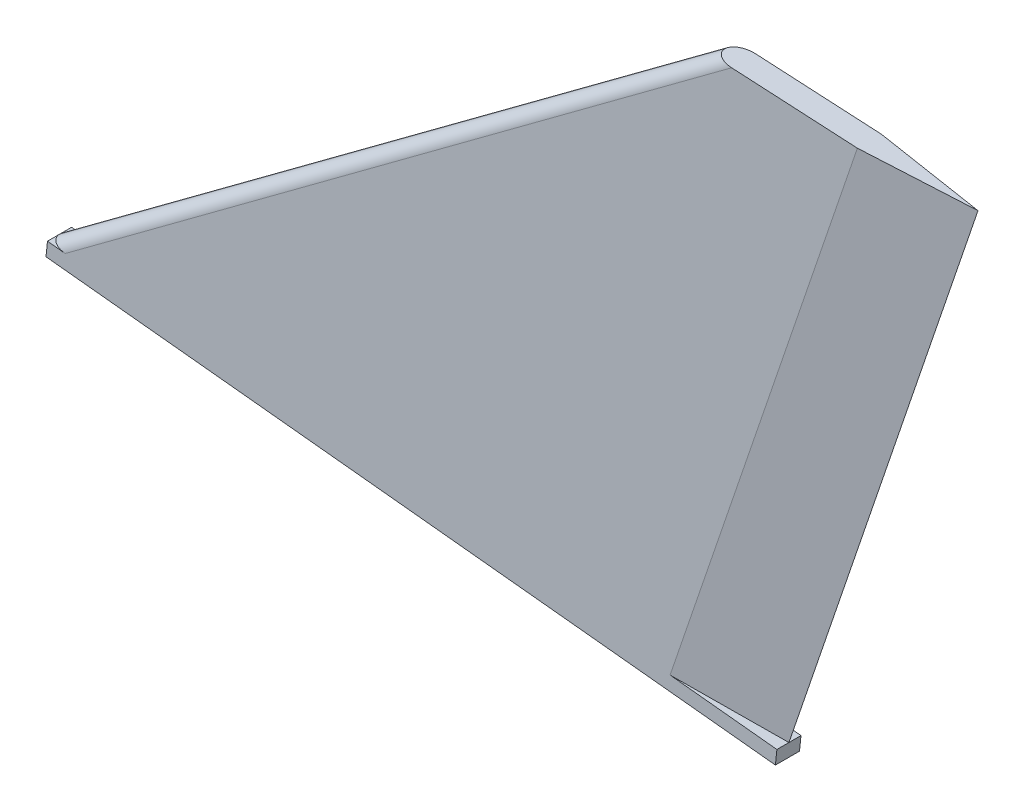
ISO-10303-21;
HEADER;
FILE_DESCRIPTION(('STEP AP214'),'2;1');
FILE_NAME('part.step','',(''),(''),'','','');
FILE_SCHEMA(('AUTOMOTIVE_DESIGN { 1 0 10303 214 1 1 1 1 }'));
ENDSEC;
DATA;
#1=APPLICATION_CONTEXT('core data for automotive mechanical design processes');
#2=APPLICATION_PROTOCOL_DEFINITION('international standard','automotive_design',2000,#1);
#3=PRODUCT_CONTEXT('',#1,'mechanical');
#4=PRODUCT('Part','Part','',(#3));
#5=PRODUCT_RELATED_PRODUCT_CATEGORY('part','',(#4));
#6=PRODUCT_DEFINITION_FORMATION('','',#4);
#7=PRODUCT_DEFINITION_CONTEXT('part definition',#1,'design');
#8=PRODUCT_DEFINITION('design','',#6,#7);
#9=PRODUCT_DEFINITION_SHAPE('','',#8);
#10=(LENGTH_UNIT() NAMED_UNIT(*) SI_UNIT(.MILLI.,.METRE.));
#11=(NAMED_UNIT(*) PLANE_ANGLE_UNIT() SI_UNIT($,.RADIAN.));
#12=(NAMED_UNIT(*) SI_UNIT($,.STERADIAN.) SOLID_ANGLE_UNIT());
#13=UNCERTAINTY_MEASURE_WITH_UNIT(LENGTH_MEASURE(1.E-05),#10,'distance_accuracy_value','');
#14=(GEOMETRIC_REPRESENTATION_CONTEXT(3) GLOBAL_UNCERTAINTY_ASSIGNED_CONTEXT((#13)) GLOBAL_UNIT_ASSIGNED_CONTEXT((#10,
#11,#12)) REPRESENTATION_CONTEXT('',''));
#15=CARTESIAN_POINT('',(0.,0.,0.));
#16=DIRECTION('',(0.,0.,1.));
#17=DIRECTION('',(1.,0.,0.));
#18=AXIS2_PLACEMENT_3D('',#15,#16,#17);
#19=CARTESIAN_POINT('',(9.88836601925948,183.938934029572,8.4));
#20=DIRECTION('',(0.0536814467868777,0.998558111614375,0.));
#21=DIRECTION('',(-0.998558111614376,0.0536814467868778,0.));
#22=AXIS2_PLACEMENT_3D('',#19,#20,#21);
#23=PLANE('',#22);
#24=DIRECTION('',(0.998558111614376,-0.0536814467868777,0.));
#25=VECTOR('',#24,1.);
#26=CARTESIAN_POINT('',(9.88836601925948,183.938934029572,0.));
#27=LINE('',#26,#25);
#28=CARTESIAN_POINT('',(238.570815180337,171.645203116019,0.));
#29=VERTEX_POINT('',#28);
#30=CARTESIAN_POINT('',(282.402590731519,169.288852394456,0.));
#31=VERTEX_POINT('',#30);
#32=EDGE_CURVE('E160',#29,#31,#27,.T.);
#33=ORIENTED_EDGE('',*,*,#32,.F.);
#34=CARTESIAN_POINT('',(238.570815180337,171.645203116019,4.2));
#35=DIRECTION('',(0.0536814467868777,0.998558111614375,0.));
#36=DIRECTION('',(-0.998558111614376,0.0536814467868778,0.));
#37=AXIS2_PLACEMENT_3D('',#34,#35,#36);
#38=ELLIPSE('',#37,6.58485411723133,4.2);
#39=CARTESIAN_POINT('',(231.995455687778,171.998687611912,4.2));
#40=VERTEX_POINT('',#39);
#41=EDGE_CURVE('E172',#29,#40,#38,.T.);
#42=ORIENTED_EDGE('',*,*,#41,.T.);
#43=CARTESIAN_POINT('',(238.570815180337,171.645203116019,4.2));
#44=DIRECTION('',(0.0536814467868777,0.998558111614375,0.));
#45=DIRECTION('',(0.998558111614376,-0.0536814467868778,0.));
#46=AXIS2_PLACEMENT_3D('',#43,#44,#45);
#47=ELLIPSE('',#46,6.58485411723133,4.2);
#48=CARTESIAN_POINT('',(238.570815180337,171.645203116019,8.4));
#49=VERTEX_POINT('',#48);
#50=EDGE_CURVE('E170',#40,#49,#47,.T.);
#51=ORIENTED_EDGE('',*,*,#50,.T.);
#52=DIRECTION('',(0.998558111614376,-0.0536814467868777,0.));
#53=VECTOR('',#52,1.);
#54=CARTESIAN_POINT('',(9.88836601925948,183.938934029572,8.4));
#55=LINE('',#54,#53);
#56=CARTESIAN_POINT('',(282.402590731518,169.288852394455,8.39999999999944));
#57=VERTEX_POINT('',#56);
#58=EDGE_CURVE('E161',#49,#57,#55,.T.);
#59=ORIENTED_EDGE('',*,*,#58,.T.);
#60=DIRECTION('',(0.992488932594118,-0.0533551740273593,-0.110086075789346));
#61=VECTOR('',#60,1.);
#62=CARTESIAN_POINT('',(13.190950670287,183.76139050943,38.2607390348345));
#63=LINE('',#62,#61);
#64=CARTESIAN_POINT('',(320.267992754489,167.253247715953,4.2));
#65=VERTEX_POINT('',#64);
#66=EDGE_CURVE('E150',#57,#65,#63,.T.);
#67=ORIENTED_EDGE('',*,*,#66,.T.);
#68=DIRECTION('',(-0.992488932594117,0.0533551740273592,-0.110086075789361));
#69=VECTOR('',#68,1.);
#70=CARTESIAN_POINT('',(14.1087280498587,183.712051750883,-29.7589399045443));
#71=LINE('',#70,#69);
#72=EDGE_CURVE('E157',#65,#31,#71,.T.);
#73=ORIENTED_EDGE('',*,*,#72,.T.);
#74=EDGE_LOOP('',(#33,#42,#51,#59,#67,#73));
#75=FACE_BOUND('',#74,.T.);
#76=ADVANCED_FACE('F35',(#75),#23,.T.);
#77=CARTESIAN_POINT('',(0.,0.,8.4));
#78=DIRECTION('',(0.,0.,1.));
#79=DIRECTION('',(1.,0.,0.));
#80=AXIS2_PLACEMENT_3D('',#77,#78,#79);
#81=PLANE('',#80);
#82=ORIENTED_EDGE('',*,*,#58,.F.);
#83=DIRECTION('',(0.803308364569868,0.59556332275593,0.));
#84=VECTOR('',#83,1.);
#85=CARTESIAN_POINT('',(2.5013659555749,-3.37389513119345,8.4));
#86=LINE('',#85,#84);
#87=CARTESIAN_POINT('',(6.18812911030566,-0.640572522482319,8.4));
#88=VERTEX_POINT('',#87);
#89=EDGE_CURVE('E11',#49,#88,#86,.F.);
#90=ORIENTED_EDGE('',*,*,#89,.T.);
#91=DIRECTION('',(-0.994684861284941,0.102966143613121,0.));
#92=VECTOR('',#91,1.);
#93=CARTESIAN_POINT('',(0.,0.,8.39999999999944));
#94=LINE('',#93,#92);
#95=CARTESIAN_POINT('',(0.,0.,8.39999999999944));
#96=VERTEX_POINT('',#95);
#97=EDGE_CURVE('E193',#88,#96,#94,.T.);
#98=ORIENTED_EDGE('',*,*,#97,.T.);
#99=DIRECTION('',(0.102966143613121,0.994684861284941,0.));
#100=VECTOR('',#99,1.);
#101=CARTESIAN_POINT('',(-0.514830718065607,-4.9734243064247,8.39999999999944));
#102=LINE('',#101,#100);
#103=CARTESIAN_POINT('',(-0.514830718065607,-4.9734243064247,8.39999999999944));
#104=VERTEX_POINT('',#103);
#105=EDGE_CURVE('E196',#104,#96,#102,.T.);
#106=ORIENTED_EDGE('',*,*,#105,.F.);
#107=DIRECTION('',(-0.994684861284941,0.102966143613121,0.));
#108=VECTOR('',#107,1.);
#109=CARTESIAN_POINT('',(-0.514830718065607,-4.9734243064247,8.39999999999944));
#110=LINE('',#109,#108);
#111=CARTESIAN_POINT('',(253.826088312494,-31.3018672282998,8.39999999999944));
#112=VERTEX_POINT('',#111);
#113=EDGE_CURVE('E129',#112,#104,#110,.T.);
#114=ORIENTED_EDGE('',*,*,#113,.F.);
#115=DIRECTION('',(0.102966143613121,0.994684861284941,0.));
#116=VECTOR('',#115,1.);
#117=CARTESIAN_POINT('',(253.826088312494,-31.3018672282998,8.39999999999944));
#118=LINE('',#117,#116);
#119=CARTESIAN_POINT('',(254.340919030559,-26.3284429218751,8.39999999999944));
#120=VERTEX_POINT('',#119);
#121=EDGE_CURVE('E142',#112,#120,#118,.T.);
#122=ORIENTED_EDGE('',*,*,#121,.T.);
#123=CARTESIAN_POINT('',(217.095318662909,-22.4729144166387,8.39999999999944));
#124=VERTEX_POINT('',#123);
#125=EDGE_CURVE('E133',#120,#124,#94,.T.);
#126=ORIENTED_EDGE('',*,*,#125,.T.);
#127=DIRECTION('',(0.322381778601121,0.946609734170306,0.));
#128=VECTOR('',#127,1.);
#129=CARTESIAN_POINT('',(193.356009176486,-92.1786575260656,8.39999999999944));
#130=LINE('',#129,#128);
#131=EDGE_CURVE('E141',#124,#57,#130,.T.);
#132=ORIENTED_EDGE('',*,*,#131,.T.);
#133=EDGE_LOOP('',(#82,#90,#98,#106,#114,#122,#126,#132));
#134=FACE_BOUND('',#133,.T.);
#135=ADVANCED_FACE('F200',(#134),#81,.T.);
#136=CARTESIAN_POINT('',(0.,0.,0.));
#137=DIRECTION('',(0.,0.,1.));
#138=DIRECTION('',(1.,0.,0.));
#139=AXIS2_PLACEMENT_3D('',#136,#137,#138);
#140=PLANE('',#139);
#141=DIRECTION('',(0.322381778601121,0.946609734170306,0.));
#142=VECTOR('',#141,1.);
#143=CARTESIAN_POINT('',(201.390652987508,-68.5865299712555,0.));
#144=LINE('',#143,#142);
#145=CARTESIAN_POINT('',(217.09531866291,-22.4729144166376,0.));
#146=VERTEX_POINT('',#145);
#147=EDGE_CURVE('E163',#146,#31,#144,.T.);
#148=ORIENTED_EDGE('',*,*,#147,.F.);
#149=DIRECTION('',(0.994684861284941,-0.102966143613121,0.));
#150=VECTOR('',#149,1.);
#151=CARTESIAN_POINT('',(0.,0.,0.));
#152=LINE('',#151,#150);
#153=CARTESIAN_POINT('',(254.340919030559,-26.3284429218751,0.));
#154=VERTEX_POINT('',#153);
#155=EDGE_CURVE('E184',#146,#154,#152,.T.);
#156=ORIENTED_EDGE('',*,*,#155,.T.);
#157=DIRECTION('',(0.102966143613121,0.994684861284941,0.));
#158=VECTOR('',#157,1.);
#159=CARTESIAN_POINT('',(253.826088312494,-31.3018672282998,0.));
#160=LINE('',#159,#158);
#161=CARTESIAN_POINT('',(253.826088312494,-31.3018672282998,0.));
#162=VERTEX_POINT('',#161);
#163=EDGE_CURVE('E120',#162,#154,#160,.T.);
#164=ORIENTED_EDGE('',*,*,#163,.F.);
#165=DIRECTION('',(0.994684861284941,-0.102966143613121,0.));
#166=VECTOR('',#165,1.);
#167=CARTESIAN_POINT('',(-0.514830718065607,-4.9734243064247,0.));
#168=LINE('',#167,#166);
#169=CARTESIAN_POINT('',(-0.514830718065607,-4.9734243064247,0.));
#170=VERTEX_POINT('',#169);
#171=EDGE_CURVE('E112',#170,#162,#168,.T.);
#172=ORIENTED_EDGE('',*,*,#171,.F.);
#173=DIRECTION('',(0.102966143613121,0.994684861284941,0.));
#174=VECTOR('',#173,1.);
#175=CARTESIAN_POINT('',(-0.514830718065607,-4.9734243064247,0.));
#176=LINE('',#175,#174);
#177=CARTESIAN_POINT('',(0.,0.,0.));
#178=VERTEX_POINT('',#177);
#179=EDGE_CURVE('E118',#170,#178,#176,.T.);
#180=ORIENTED_EDGE('',*,*,#179,.T.);
#181=CARTESIAN_POINT('',(6.18812911030566,-0.640572522482318,0.));
#182=VERTEX_POINT('',#181);
#183=EDGE_CURVE('E180',#178,#182,#152,.T.);
#184=ORIENTED_EDGE('',*,*,#183,.T.);
#185=DIRECTION('',(0.803308364569868,0.59556332275593,0.));
#186=VECTOR('',#185,1.);
#187=CARTESIAN_POINT('',(234.496821643353,168.624792480719,0.));
#188=LINE('',#187,#186);
#189=EDGE_CURVE('E167',#182,#29,#188,.T.);
#190=ORIENTED_EDGE('',*,*,#189,.T.);
#191=ORIENTED_EDGE('',*,*,#32,.T.);
#192=EDGE_LOOP('',(#148,#156,#164,#172,#180,#184,#190,#191));
#193=FACE_BOUND('',#192,.T.);
#194=ADVANCED_FACE('F115',(#193),#140,.F.);
#195=CARTESIAN_POINT('',(193.356009176486,-92.1786575260656,0.));
#196=DIRECTION('',(0.108210914281827,-0.0368528082386616,-0.993444647957407));
#197=DIRECTION('',(-0.994119949124248,0.,-0.108284471431517));
#198=AXIS2_PLACEMENT_3D('',#195,#196,#197);
#199=PLANE('',#198);
#200=DIRECTION('',(0.322381778601121,0.946609734170306,0.));
#201=VECTOR('',#200,1.);
#202=CARTESIAN_POINT('',(227.907264473702,-103.945592445007,4.2));
#203=LINE('',#202,#201);
#204=CARTESIAN_POINT('',(254.340919030559,-26.3284429218751,4.2));
#205=VERTEX_POINT('',#204);
#206=EDGE_CURVE('E153',#205,#65,#203,.T.);
#207=ORIENTED_EDGE('',*,*,#206,.F.);
#208=DIRECTION('',(-0.988486160720546,0.102324476772325,-0.111466638584038));
#209=VECTOR('',#208,1.);
#210=CARTESIAN_POINT('',(3.62290754448626,-0.375030155823163,-24.072215720709));
#211=LINE('',#210,#209);
#212=EDGE_CURVE('E155',#205,#146,#211,.T.);
#213=ORIENTED_EDGE('',*,*,#212,.T.);
#214=ORIENTED_EDGE('',*,*,#147,.T.);
#215=ORIENTED_EDGE('',*,*,#72,.F.);
#216=EDGE_LOOP('',(#207,#213,#214,#215));
#217=FACE_BOUND('',#216,.T.);
#218=ADVANCED_FACE('F213',(#217),#199,.T.);
#219=CARTESIAN_POINT('',(227.907264473702,-103.945592445007,4.2));
#220=DIRECTION('',(0.108210914281812,-0.0368528082386567,0.993444647957408));
#221=DIRECTION('',(0.994119949124249,0.,-0.108284471431503));
#222=AXIS2_PLACEMENT_3D('',#219,#220,#221);
#223=PLANE('',#222);
#224=ORIENTED_EDGE('',*,*,#131,.F.);
#225=DIRECTION('',(0.988486160720548,-0.102324476772326,-0.111466638584023));
#226=VECTOR('',#225,1.);
#227=CARTESIAN_POINT('',(2.69736841565766,-0.279221725869358,32.5765841374499));
#228=LINE('',#227,#226);
#229=EDGE_CURVE('E148',#124,#205,#228,.T.);
#230=ORIENTED_EDGE('',*,*,#229,.T.);
#231=ORIENTED_EDGE('',*,*,#206,.T.);
#232=ORIENTED_EDGE('',*,*,#66,.F.);
#233=EDGE_LOOP('',(#224,#230,#231,#232));
#234=FACE_BOUND('',#233,.T.);
#235=ADVANCED_FACE('F208',(#234),#223,.T.);
#236=CARTESIAN_POINT('',(2.5013659555749,-3.37389513119345,4.2));
#237=DIRECTION('',(0.803308364569868,0.59556332275593,0.));
#238=DIRECTION('',(-0.59556332275593,0.803308364569868,0.));
#239=AXIS2_PLACEMENT_3D('',#236,#237,#238);
#240=CYLINDRICAL_SURFACE('',#239,4.2);
#241=DIRECTION('',(0.803308364569868,0.59556332275593,0.));
#242=VECTOR('',#241,1.);
#243=CARTESIAN_POINT('',(0.,0.,4.2));
#244=LINE('',#243,#242);
#245=CARTESIAN_POINT('',(0.,0.,4.2));
#246=VERTEX_POINT('',#245);
#247=EDGE_CURVE('E39',#246,#40,#244,.T.);
#248=ORIENTED_EDGE('',*,*,#247,.F.);
#249=CARTESIAN_POINT('',(6.18812911030566,-0.640572522482318,4.2));
#250=DIRECTION('',(0.102966143613121,0.994684861284941,0.));
#251=DIRECTION('',(0.994684861284941,-0.102966143613121,0.));
#252=AXIS2_PLACEMENT_3D('',#249,#250,#251);
#253=ELLIPSE('',#252,6.22119562804222,4.2);
#254=EDGE_CURVE('E174',#88,#246,#253,.F.);
#255=ORIENTED_EDGE('',*,*,#254,.F.);
#256=ORIENTED_EDGE('',*,*,#89,.F.);
#257=ORIENTED_EDGE('',*,*,#50,.F.);
#258=EDGE_LOOP('',(#248,#255,#256,#257));
#259=FACE_BOUND('',#258,.T.);
#260=ADVANCED_FACE('F37',(#259),#240,.T.);
#261=CARTESIAN_POINT('',(2.5013659555749,-3.37389513119345,4.2));
#262=DIRECTION('',(-0.803308364569868,-0.59556332275593,0.));
#263=DIRECTION('',(0.59556332275593,-0.803308364569868,0.));
#264=AXIS2_PLACEMENT_3D('',#261,#262,#263);
#265=CYLINDRICAL_SURFACE('',#264,4.2);
#266=CARTESIAN_POINT('',(6.18812911030566,-0.640572522482318,4.2));
#267=DIRECTION('',(0.102966143613121,0.994684861284941,0.));
#268=DIRECTION('',(-0.994684861284941,0.102966143613121,0.));
#269=AXIS2_PLACEMENT_3D('',#266,#267,#268);
#270=ELLIPSE('',#269,6.22119562804222,4.2);
#271=EDGE_CURVE('E44',#246,#182,#270,.F.);
#272=ORIENTED_EDGE('',*,*,#271,.F.);
#273=ORIENTED_EDGE('',*,*,#247,.T.);
#274=ORIENTED_EDGE('',*,*,#41,.F.);
#275=ORIENTED_EDGE('',*,*,#189,.F.);
#276=EDGE_LOOP('',(#272,#273,#274,#275));
#277=FACE_BOUND('',#276,.T.);
#278=ADVANCED_FACE('F239',(#277),#265,.T.);
#279=CARTESIAN_POINT('',(0.,0.,0.));
#280=DIRECTION('',(0.102966143613121,0.994684861284941,0.));
#281=DIRECTION('',(-0.994684861284941,0.102966143613121,0.));
#282=AXIS2_PLACEMENT_3D('',#279,#280,#281);
#283=PLANE('',#282);
#284=ORIENTED_EDGE('',*,*,#155,.F.);
#285=ORIENTED_EDGE('',*,*,#212,.F.);
#286=DIRECTION('',(0.,0.,1.));
#287=VECTOR('',#286,1.);
#288=CARTESIAN_POINT('',(254.340919030559,-26.3284429218751,0.));
#289=LINE('',#288,#287);
#290=EDGE_CURVE('E186',#154,#205,#289,.T.);
#291=ORIENTED_EDGE('',*,*,#290,.F.);
#292=EDGE_LOOP('',(#284,#285,#291));
#293=FACE_BOUND('',#292,.T.);
#294=ADVANCED_FACE('F217',(#293),#283,.T.);
#295=EDGE_CURVE('E183',#205,#120,#289,.T.);
#296=ORIENTED_EDGE('',*,*,#295,.F.);
#297=ORIENTED_EDGE('',*,*,#229,.F.);
#298=ORIENTED_EDGE('',*,*,#125,.F.);
#299=EDGE_LOOP('',(#296,#297,#298));
#300=FACE_BOUND('',#299,.T.);
#301=ADVANCED_FACE('F205',(#300),#283,.T.);
#302=ORIENTED_EDGE('',*,*,#97,.F.);
#303=ORIENTED_EDGE('',*,*,#254,.T.);
#304=DIRECTION('',(0.,0.,-1.));
#305=VECTOR('',#304,1.);
#306=CARTESIAN_POINT('',(0.,0.,0.));
#307=LINE('',#306,#305);
#308=EDGE_CURVE('E188',#96,#246,#307,.T.);
#309=ORIENTED_EDGE('',*,*,#308,.F.);
#310=EDGE_LOOP('',(#302,#303,#309));
#311=FACE_BOUND('',#310,.T.);
#312=ADVANCED_FACE('F227',(#311),#283,.T.);
#313=CARTESIAN_POINT('',(-0.514830718065607,-4.9734243064247,0.));
#314=DIRECTION('',(0.994684861284941,-0.102966143613121,0.));
#315=DIRECTION('',(0.102966143613121,0.994684861284941,0.));
#316=AXIS2_PLACEMENT_3D('',#313,#314,#315);
#317=PLANE('',#316);
#318=ORIENTED_EDGE('',*,*,#308,.T.);
#319=EDGE_CURVE('E138',#246,#178,#307,.T.);
#320=ORIENTED_EDGE('',*,*,#319,.T.);
#321=ORIENTED_EDGE('',*,*,#179,.F.);
#322=DIRECTION('',(0.,0.,-1.));
#323=VECTOR('',#322,1.);
#324=CARTESIAN_POINT('',(-0.514830718065607,-4.9734243064247,0.));
#325=LINE('',#324,#323);
#326=EDGE_CURVE('E124',#104,#170,#325,.T.);
#327=ORIENTED_EDGE('',*,*,#326,.F.);
#328=ORIENTED_EDGE('',*,*,#105,.T.);
#329=EDGE_LOOP('',(#318,#320,#321,#327,#328));
#330=FACE_BOUND('',#329,.T.);
#331=ADVANCED_FACE('F136',(#330),#317,.F.);
#332=CARTESIAN_POINT('',(253.826088312494,-31.3018672282998,0.));
#333=DIRECTION('',(-0.994684861284941,0.102966143613121,0.));
#334=DIRECTION('',(-0.102966143613121,-0.994684861284941,0.));
#335=AXIS2_PLACEMENT_3D('',#332,#333,#334);
#336=PLANE('',#335);
#337=ORIENTED_EDGE('',*,*,#290,.T.);
#338=ORIENTED_EDGE('',*,*,#295,.T.);
#339=ORIENTED_EDGE('',*,*,#121,.F.);
#340=DIRECTION('',(0.,0.,1.));
#341=VECTOR('',#340,1.);
#342=CARTESIAN_POINT('',(253.826088312494,-31.3018672282998,0.));
#343=LINE('',#342,#341);
#344=EDGE_CURVE('E123',#162,#112,#343,.T.);
#345=ORIENTED_EDGE('',*,*,#344,.F.);
#346=ORIENTED_EDGE('',*,*,#163,.T.);
#347=EDGE_LOOP('',(#337,#338,#339,#345,#346));
#348=FACE_BOUND('',#347,.T.);
#349=ADVANCED_FACE('F218',(#348),#336,.F.);
#350=CARTESIAN_POINT('',(-0.514830718065607,-4.9734243064247,0.));
#351=DIRECTION('',(0.102966143613121,0.994684861284941,0.));
#352=DIRECTION('',(-0.994684861284941,0.102966143613121,0.));
#353=AXIS2_PLACEMENT_3D('',#350,#351,#352);
#354=PLANE('',#353);
#355=ORIENTED_EDGE('',*,*,#326,.T.);
#356=ORIENTED_EDGE('',*,*,#171,.T.);
#357=ORIENTED_EDGE('',*,*,#344,.T.);
#358=ORIENTED_EDGE('',*,*,#113,.T.);
#359=EDGE_LOOP('',(#355,#356,#357,#358));
#360=FACE_BOUND('',#359,.T.);
#361=ADVANCED_FACE('F127',(#360),#354,.F.);
#362=ORIENTED_EDGE('',*,*,#319,.F.);
#363=ORIENTED_EDGE('',*,*,#271,.T.);
#364=ORIENTED_EDGE('',*,*,#183,.F.);
#365=EDGE_LOOP('',(#362,#363,#364));
#366=FACE_BOUND('',#365,.T.);
#367=ADVANCED_FACE('F179',(#366),#283,.T.);
#368=CLOSED_SHELL('',(#76,#135,#194,#218,#235,#260,#278,#294,#301,#312,#331,#349,#361,#367));
#369=MANIFOLD_SOLID_BREP('B2',#368);
#370=ADVANCED_BREP_SHAPE_REPRESENTATION('',(#18,#369),#14);
#371=SHAPE_DEFINITION_REPRESENTATION(#9,#370);
ENDSEC;
END-ISO-10303-21;
